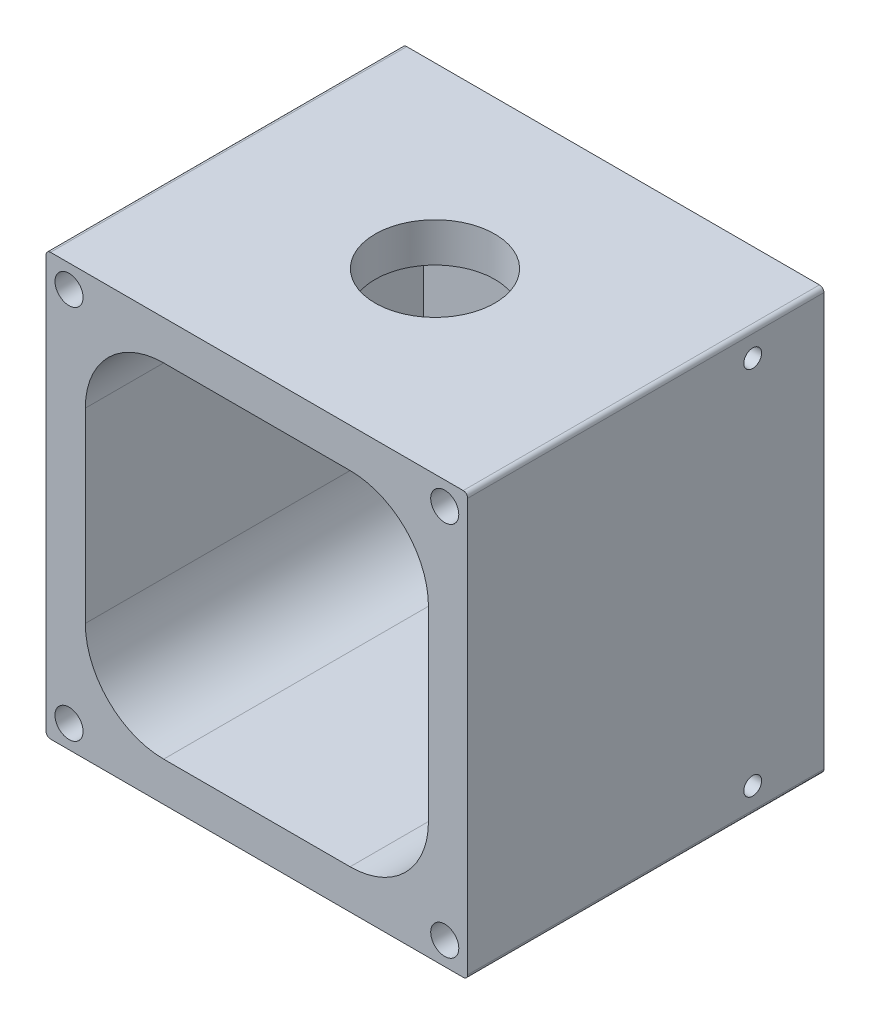
ISO-10303-21;
HEADER;
FILE_DESCRIPTION(('STEP AP214'),'2;1');
FILE_NAME('part.step','',(''),(''),'','','');
FILE_SCHEMA(('AUTOMOTIVE_DESIGN { 1 0 10303 214 1 1 1 1 }'));
ENDSEC;
DATA;
#1=APPLICATION_CONTEXT('core data for automotive mechanical design processes');
#2=APPLICATION_PROTOCOL_DEFINITION('international standard','automotive_design',2000,#1);
#3=PRODUCT_CONTEXT('',#1,'mechanical');
#4=PRODUCT('Part','Part','',(#3));
#5=PRODUCT_RELATED_PRODUCT_CATEGORY('part','',(#4));
#6=PRODUCT_DEFINITION_FORMATION('','',#4);
#7=PRODUCT_DEFINITION_CONTEXT('part definition',#1,'design');
#8=PRODUCT_DEFINITION('design','',#6,#7);
#9=PRODUCT_DEFINITION_SHAPE('','',#8);
#10=(LENGTH_UNIT() NAMED_UNIT(*) SI_UNIT(.MILLI.,.METRE.));
#11=(NAMED_UNIT(*) PLANE_ANGLE_UNIT() SI_UNIT($,.RADIAN.));
#12=(NAMED_UNIT(*) SI_UNIT($,.STERADIAN.) SOLID_ANGLE_UNIT());
#13=UNCERTAINTY_MEASURE_WITH_UNIT(LENGTH_MEASURE(1.E-05),#10,'distance_accuracy_value','');
#14=(GEOMETRIC_REPRESENTATION_CONTEXT(3) GLOBAL_UNCERTAINTY_ASSIGNED_CONTEXT((#13)) GLOBAL_UNIT_ASSIGNED_CONTEXT((#10,
#11,#12)) REPRESENTATION_CONTEXT('',''));
#15=CARTESIAN_POINT('',(0.,0.,0.));
#16=DIRECTION('',(0.,0.,1.));
#17=DIRECTION('',(1.,0.,0.));
#18=AXIS2_PLACEMENT_3D('',#15,#16,#17);
#19=CARTESIAN_POINT('',(0.,-30.5825455152328,-63.5));
#20=DIRECTION('',(0.,-1.,0.));
#21=DIRECTION('',(0.,0.,-1.));
#22=AXIS2_PLACEMENT_3D('',#19,#20,#21);
#23=PLANE('',#22);
#24=DIRECTION('',(0.,0.,1.));
#25=VECTOR('',#24,1.);
#26=CARTESIAN_POINT('',(16.6157149595406,-30.5825455152328,-63.5));
#27=LINE('',#26,#25);
#28=CARTESIAN_POINT('',(16.6157149595406,-30.5825455152328,-60.325));
#29=VERTEX_POINT('',#28);
#30=CARTESIAN_POINT('',(16.6157149595406,-30.5825455152328,0.));
#31=VERTEX_POINT('',#30);
#32=EDGE_CURVE('E50',#29,#31,#27,.T.);
#33=ORIENTED_EDGE('',*,*,#32,.F.);
#34=DIRECTION('',(-1.,0.,0.));
#35=VECTOR('',#34,1.);
#36=CARTESIAN_POINT('',(0.,-30.5825455152328,-60.325));
#37=LINE('',#36,#35);
#38=CARTESIAN_POINT('',(-16.6157149595406,-30.5825455152328,-60.325));
#39=VERTEX_POINT('',#38);
#40=EDGE_CURVE('E169',#29,#39,#37,.T.);
#41=ORIENTED_EDGE('',*,*,#40,.T.);
#42=DIRECTION('',(0.,0.,1.));
#43=VECTOR('',#42,1.);
#44=CARTESIAN_POINT('',(-16.6157149595406,-30.5825455152328,-63.5));
#45=LINE('',#44,#43);
#46=CARTESIAN_POINT('',(-16.6157149595406,-30.5825455152328,0.));
#47=VERTEX_POINT('',#46);
#48=EDGE_CURVE('E155',#39,#47,#45,.T.);
#49=ORIENTED_EDGE('',*,*,#48,.T.);
#50=DIRECTION('',(1.,0.,0.));
#51=VECTOR('',#50,1.);
#52=CARTESIAN_POINT('',(0.,-30.5825455152328,0.));
#53=LINE('',#52,#51);
#54=EDGE_CURVE('E297',#47,#31,#53,.T.);
#55=ORIENTED_EDGE('',*,*,#54,.T.);
#56=EDGE_LOOP('',(#33,#41,#49,#55));
#57=FACE_BOUND('',#56,.T.);
#58=ADVANCED_FACE('F41',(#57),#23,.F.);
#59=CARTESIAN_POINT('',(16.6157149595406,-16.6157149595406,-63.5));
#60=DIRECTION('',(0.,0.,1.));
#61=DIRECTION('',(1.,0.,0.));
#62=AXIS2_PLACEMENT_3D('',#59,#60,#61);
#63=CYLINDRICAL_SURFACE('',#62,13.9668305556922);
#64=CARTESIAN_POINT('',(16.6157149595406,-16.6157149595406,-60.325));
#65=DIRECTION('',(0.,0.,1.));
#66=DIRECTION('',(1.,0.,0.));
#67=AXIS2_PLACEMENT_3D('',#64,#65,#66);
#68=CIRCLE('',#67,13.9668305556922);
#69=CARTESIAN_POINT('',(30.5825455152328,-16.6157149595406,-60.325));
#70=VERTEX_POINT('',#69);
#71=EDGE_CURVE('E57',#29,#70,#68,.T.);
#72=ORIENTED_EDGE('',*,*,#71,.F.);
#73=ORIENTED_EDGE('',*,*,#32,.T.);
#74=CARTESIAN_POINT('',(16.6157149595406,-16.6157149595406,0.));
#75=DIRECTION('',(0.,0.,1.));
#76=DIRECTION('',(1.,0.,0.));
#77=AXIS2_PLACEMENT_3D('',#74,#75,#76);
#78=CIRCLE('',#77,13.9668305556922);
#79=CARTESIAN_POINT('',(30.5825455152328,-16.6157149595406,0.));
#80=VERTEX_POINT('',#79);
#81=EDGE_CURVE('E242',#80,#31,#78,.F.);
#82=ORIENTED_EDGE('',*,*,#81,.F.);
#83=DIRECTION('',(0.,0.,1.));
#84=VECTOR('',#83,1.);
#85=CARTESIAN_POINT('',(30.5825455152328,-16.6157149595406,-63.5));
#86=LINE('',#85,#84);
#87=EDGE_CURVE('E327',#70,#80,#86,.T.);
#88=ORIENTED_EDGE('',*,*,#87,.F.);
#89=EDGE_LOOP('',(#72,#73,#82,#88));
#90=FACE_BOUND('',#89,.T.);
#91=ADVANCED_FACE('F416',(#90),#63,.F.);
#92=CARTESIAN_POINT('',(30.5825455152328,0.,-63.5));
#93=DIRECTION('',(1.,0.,0.));
#94=DIRECTION('',(0.,0.,-1.));
#95=AXIS2_PLACEMENT_3D('',#92,#93,#94);
#96=PLANE('',#95);
#97=DIRECTION('',(0.,0.,1.));
#98=VECTOR('',#97,1.);
#99=CARTESIAN_POINT('',(30.5825455152328,16.6157149595406,-63.5));
#100=LINE('',#99,#98);
#101=CARTESIAN_POINT('',(30.5825455152328,16.6157149595406,-60.325));
#102=VERTEX_POINT('',#101);
#103=CARTESIAN_POINT('',(30.5825455152328,16.6157149595406,0.));
#104=VERTEX_POINT('',#103);
#105=EDGE_CURVE('E330',#102,#104,#100,.T.);
#106=ORIENTED_EDGE('',*,*,#105,.F.);
#107=DIRECTION('',(0.,-1.,0.));
#108=VECTOR('',#107,1.);
#109=CARTESIAN_POINT('',(30.5825455152328,0.,-60.325));
#110=LINE('',#109,#108);
#111=EDGE_CURVE('E65',#102,#70,#110,.T.);
#112=ORIENTED_EDGE('',*,*,#111,.T.);
#113=ORIENTED_EDGE('',*,*,#87,.T.);
#114=DIRECTION('',(0.,1.,0.));
#115=VECTOR('',#114,1.);
#116=CARTESIAN_POINT('',(30.5825455152328,0.,0.));
#117=LINE('',#116,#115);
#118=EDGE_CURVE('E318',#80,#104,#117,.T.);
#119=ORIENTED_EDGE('',*,*,#118,.T.);
#120=EDGE_LOOP('',(#106,#112,#113,#119));
#121=FACE_BOUND('',#120,.T.);
#122=ADVANCED_FACE('F421',(#121),#96,.F.);
#123=CARTESIAN_POINT('',(16.6157149595406,16.6157149595406,-63.5));
#124=DIRECTION('',(0.,0.,1.));
#125=DIRECTION('',(1.,0.,0.));
#126=AXIS2_PLACEMENT_3D('',#123,#124,#125);
#127=CYLINDRICAL_SURFACE('',#126,13.9668305556922);
#128=CARTESIAN_POINT('',(16.6157149595406,16.6157149595406,-60.325));
#129=DIRECTION('',(0.,0.,1.));
#130=DIRECTION('',(1.,0.,0.));
#131=AXIS2_PLACEMENT_3D('',#128,#129,#130);
#132=CIRCLE('',#131,13.9668305556922);
#133=CARTESIAN_POINT('',(16.6157149595406,30.5825455152328,-60.325));
#134=VERTEX_POINT('',#133);
#135=EDGE_CURVE('E197',#102,#134,#132,.T.);
#136=ORIENTED_EDGE('',*,*,#135,.F.);
#137=ORIENTED_EDGE('',*,*,#105,.T.);
#138=CARTESIAN_POINT('',(16.6157149595406,16.6157149595406,0.));
#139=DIRECTION('',(0.,0.,1.));
#140=DIRECTION('',(1.,0.,0.));
#141=AXIS2_PLACEMENT_3D('',#138,#139,#140);
#142=CIRCLE('',#141,13.9668305556922);
#143=CARTESIAN_POINT('',(16.6157149595406,30.5825455152328,0.));
#144=VERTEX_POINT('',#143);
#145=EDGE_CURVE('E314',#144,#104,#142,.F.);
#146=ORIENTED_EDGE('',*,*,#145,.F.);
#147=DIRECTION('',(0.,0.,1.));
#148=VECTOR('',#147,1.);
#149=CARTESIAN_POINT('',(16.6157149595406,30.5825455152328,-63.5));
#150=LINE('',#149,#148);
#151=EDGE_CURVE('E333',#134,#144,#150,.T.);
#152=ORIENTED_EDGE('',*,*,#151,.F.);
#153=EDGE_LOOP('',(#136,#137,#146,#152));
#154=FACE_BOUND('',#153,.T.);
#155=ADVANCED_FACE('F436',(#154),#127,.F.);
#156=CARTESIAN_POINT('',(0.,30.5825455152328,-63.5));
#157=DIRECTION('',(0.,-1.,0.));
#158=DIRECTION('',(0.,0.,-1.));
#159=AXIS2_PLACEMENT_3D('',#156,#157,#158);
#160=PLANE('',#159);
#161=CARTESIAN_POINT('',(0.,30.5825455152328,-31.75));
#162=DIRECTION('',(0.,-1.,0.));
#163=DIRECTION('',(0.,0.,-1.));
#164=AXIS2_PLACEMENT_3D('',#161,#162,#163);
#165=CIRCLE('',#164,10.668);
#166=CARTESIAN_POINT('',(0.,30.5825455152328,-42.418));
#167=VERTEX_POINT('',#166);
#168=EDGE_CURVE('E510',#167,#167,#165,.T.);
#169=ORIENTED_EDGE('',*,*,#168,.F.);
#170=EDGE_LOOP('',(#169));
#171=FACE_BOUND('',#170,.T.);
#172=DIRECTION('',(-1.,0.,0.));
#173=VECTOR('',#172,1.);
#174=CARTESIAN_POINT('',(0.,30.5825455152328,-60.325));
#175=LINE('',#174,#173);
#176=CARTESIAN_POINT('',(-16.6157149595406,30.5825455152328,-60.325));
#177=VERTEX_POINT('',#176);
#178=EDGE_CURVE('E188',#134,#177,#175,.T.);
#179=ORIENTED_EDGE('',*,*,#178,.F.);
#180=ORIENTED_EDGE('',*,*,#151,.T.);
#181=DIRECTION('',(1.,0.,0.));
#182=VECTOR('',#181,1.);
#183=CARTESIAN_POINT('',(0.,30.5825455152328,0.));
#184=LINE('',#183,#182);
#185=CARTESIAN_POINT('',(-16.6157149595406,30.5825455152328,0.));
#186=VERTEX_POINT('',#185);
#187=EDGE_CURVE('E310',#186,#144,#184,.T.);
#188=ORIENTED_EDGE('',*,*,#187,.F.);
#189=DIRECTION('',(0.,0.,1.));
#190=VECTOR('',#189,1.);
#191=CARTESIAN_POINT('',(-16.6157149595406,30.5825455152328,-63.5));
#192=LINE('',#191,#190);
#193=EDGE_CURVE('E336',#177,#186,#192,.T.);
#194=ORIENTED_EDGE('',*,*,#193,.F.);
#195=EDGE_LOOP('',(#179,#180,#188,#194));
#196=FACE_BOUND('',#195,.T.);
#197=ADVANCED_FACE('F432',(#171,#196),#160,.T.);
#198=CARTESIAN_POINT('',(-16.6157149595406,16.6157149595406,-63.5));
#199=DIRECTION('',(0.,0.,1.));
#200=DIRECTION('',(1.,0.,0.));
#201=AXIS2_PLACEMENT_3D('',#198,#199,#200);
#202=CYLINDRICAL_SURFACE('',#201,13.9668305556922);
#203=CARTESIAN_POINT('',(-16.6157149595406,16.6157149595406,-60.325));
#204=DIRECTION('',(0.,0.,1.));
#205=DIRECTION('',(1.,0.,0.));
#206=AXIS2_PLACEMENT_3D('',#203,#204,#205);
#207=CIRCLE('',#206,13.9668305556922);
#208=CARTESIAN_POINT('',(-30.5825455152328,16.6157149595406,-60.325));
#209=VERTEX_POINT('',#208);
#210=EDGE_CURVE('E180',#177,#209,#207,.T.);
#211=ORIENTED_EDGE('',*,*,#210,.F.);
#212=ORIENTED_EDGE('',*,*,#193,.T.);
#213=CARTESIAN_POINT('',(-16.6157149595406,16.6157149595406,0.));
#214=DIRECTION('',(0.,0.,1.));
#215=DIRECTION('',(1.,0.,0.));
#216=AXIS2_PLACEMENT_3D('',#213,#214,#215);
#217=CIRCLE('',#216,13.9668305556922);
#218=CARTESIAN_POINT('',(-30.5825455152328,16.6157149595406,0.));
#219=VERTEX_POINT('',#218);
#220=EDGE_CURVE('E306',#219,#186,#217,.F.);
#221=ORIENTED_EDGE('',*,*,#220,.F.);
#222=DIRECTION('',(0.,0.,1.));
#223=VECTOR('',#222,1.);
#224=CARTESIAN_POINT('',(-30.5825455152328,16.6157149595406,-63.5));
#225=LINE('',#224,#223);
#226=EDGE_CURVE('E339',#209,#219,#225,.T.);
#227=ORIENTED_EDGE('',*,*,#226,.F.);
#228=EDGE_LOOP('',(#211,#212,#221,#227));
#229=FACE_BOUND('',#228,.T.);
#230=ADVANCED_FACE('F429',(#229),#202,.F.);
#231=CARTESIAN_POINT('',(-30.5825455152328,0.,-63.5));
#232=DIRECTION('',(1.,0.,0.));
#233=DIRECTION('',(0.,0.,-1.));
#234=AXIS2_PLACEMENT_3D('',#231,#232,#233);
#235=PLANE('',#234);
#236=DIRECTION('',(0.,-1.,0.));
#237=VECTOR('',#236,1.);
#238=CARTESIAN_POINT('',(-30.5825455152328,0.,-60.325));
#239=LINE('',#238,#237);
#240=CARTESIAN_POINT('',(-30.5825455152328,-16.6157149595406,-60.325));
#241=VERTEX_POINT('',#240);
#242=EDGE_CURVE('E178',#209,#241,#239,.T.);
#243=ORIENTED_EDGE('',*,*,#242,.F.);
#244=ORIENTED_EDGE('',*,*,#226,.T.);
#245=DIRECTION('',(0.,1.,0.));
#246=VECTOR('',#245,1.);
#247=CARTESIAN_POINT('',(-30.5825455152328,0.,0.));
#248=LINE('',#247,#246);
#249=CARTESIAN_POINT('',(-30.5825455152328,-16.6157149595406,0.));
#250=VERTEX_POINT('',#249);
#251=EDGE_CURVE('E302',#250,#219,#248,.T.);
#252=ORIENTED_EDGE('',*,*,#251,.F.);
#253=DIRECTION('',(0.,0.,1.));
#254=VECTOR('',#253,1.);
#255=CARTESIAN_POINT('',(-30.5825455152328,-16.6157149595406,-63.5));
#256=LINE('',#255,#254);
#257=EDGE_CURVE('E165',#241,#250,#256,.T.);
#258=ORIENTED_EDGE('',*,*,#257,.F.);
#259=EDGE_LOOP('',(#243,#244,#252,#258));
#260=FACE_BOUND('',#259,.T.);
#261=ADVANCED_FACE('F426',(#260),#235,.T.);
#262=CARTESIAN_POINT('',(-36.7839839528867,36.7839839528867,-63.5));
#263=DIRECTION('',(0.,0.,1.));
#264=DIRECTION('',(1.,0.,0.));
#265=AXIS2_PLACEMENT_3D('',#262,#263,#264);
#266=CYLINDRICAL_SURFACE('',#265,0.793750000000006);
#267=CARTESIAN_POINT('',(-36.7839839528867,36.7839839528867,0.));
#268=DIRECTION('',(0.,0.,1.));
#269=DIRECTION('',(1.,0.,0.));
#270=AXIS2_PLACEMENT_3D('',#267,#268,#269);
#271=CIRCLE('',#270,0.793750000000006);
#272=CARTESIAN_POINT('',(-37.5777339528867,36.7839839528867,0.));
#273=VERTEX_POINT('',#272);
#274=CARTESIAN_POINT('',(-36.7839839528867,37.5777339528867,0.));
#275=VERTEX_POINT('',#274);
#276=EDGE_CURVE('E233',#273,#275,#271,.F.);
#277=ORIENTED_EDGE('',*,*,#276,.T.);
#278=DIRECTION('',(0.,0.,1.));
#279=VECTOR('',#278,1.);
#280=CARTESIAN_POINT('',(-36.7839839528867,37.5777339528867,-63.5));
#281=LINE('',#280,#279);
#282=CARTESIAN_POINT('',(-36.7839839528867,37.5777339528867,-63.5));
#283=VERTEX_POINT('',#282);
#284=EDGE_CURVE('E166',#283,#275,#281,.T.);
#285=ORIENTED_EDGE('',*,*,#284,.F.);
#286=CARTESIAN_POINT('',(-36.7839839528867,36.7839839528867,-63.5));
#287=DIRECTION('',(0.,0.,1.));
#288=DIRECTION('',(1.,0.,0.));
#289=AXIS2_PLACEMENT_3D('',#286,#287,#288);
#290=CIRCLE('',#289,0.793750000000006);
#291=CARTESIAN_POINT('',(-37.5777339528867,36.7839839528867,-63.5));
#292=VERTEX_POINT('',#291);
#293=EDGE_CURVE('E237',#292,#283,#290,.F.);
#294=ORIENTED_EDGE('',*,*,#293,.F.);
#295=DIRECTION('',(0.,0.,1.));
#296=VECTOR('',#295,1.);
#297=CARTESIAN_POINT('',(-37.5777339528867,36.7839839528867,-63.5));
#298=LINE('',#297,#296);
#299=EDGE_CURVE('E265',#292,#273,#298,.T.);
#300=ORIENTED_EDGE('',*,*,#299,.T.);
#301=EDGE_LOOP('',(#277,#285,#294,#300));
#302=FACE_BOUND('',#301,.T.);
#303=ADVANCED_FACE('F43',(#302),#266,.T.);
#304=CARTESIAN_POINT('',(0.,37.5777339528867,-63.5));
#305=DIRECTION('',(0.,-1.,0.));
#306=DIRECTION('',(0.,0.,-1.));
#307=AXIS2_PLACEMENT_3D('',#304,#305,#306);
#308=PLANE('',#307);
#309=CARTESIAN_POINT('',(0.,37.5777339528867,-31.75));
#310=DIRECTION('',(0.,1.,0.));
#311=DIRECTION('',(-1.,0.,0.));
#312=AXIS2_PLACEMENT_3D('',#309,#310,#311);
#313=CIRCLE('',#312,10.668);
#314=CARTESIAN_POINT('',(-10.668,37.5777339528867,-31.75));
#315=VERTEX_POINT('',#314);
#316=EDGE_CURVE('E513',#315,#315,#313,.F.);
#317=ORIENTED_EDGE('',*,*,#316,.T.);
#318=EDGE_LOOP('',(#317));
#319=FACE_BOUND('',#318,.T.);
#320=DIRECTION('',(1.,0.,0.));
#321=VECTOR('',#320,1.);
#322=CARTESIAN_POINT('',(0.,37.5777339528867,0.));
#323=LINE('',#322,#321);
#324=CARTESIAN_POINT('',(36.783983997871,37.5777339528867,0.));
#325=VERTEX_POINT('',#324);
#326=EDGE_CURVE('E293',#275,#325,#323,.T.);
#327=ORIENTED_EDGE('',*,*,#326,.T.);
#328=DIRECTION('',(0.,0.,1.));
#329=VECTOR('',#328,1.);
#330=CARTESIAN_POINT('',(36.783983997871,37.5777339528867,-63.5));
#331=LINE('',#330,#329);
#332=CARTESIAN_POINT('',(36.783983997871,37.5777339528867,-63.5));
#333=VERTEX_POINT('',#332);
#334=EDGE_CURVE('E346',#333,#325,#331,.T.);
#335=ORIENTED_EDGE('',*,*,#334,.F.);
#336=DIRECTION('',(1.,0.,0.));
#337=VECTOR('',#336,1.);
#338=CARTESIAN_POINT('',(0.,37.5777339528867,-63.5));
#339=LINE('',#338,#337);
#340=EDGE_CURVE('E262',#283,#333,#339,.T.);
#341=ORIENTED_EDGE('',*,*,#340,.F.);
#342=ORIENTED_EDGE('',*,*,#284,.T.);
#343=EDGE_LOOP('',(#327,#335,#341,#342));
#344=FACE_BOUND('',#343,.T.);
#345=ADVANCED_FACE('F383',(#319,#344),#308,.F.);
#346=CARTESIAN_POINT('',(36.783983997871,36.7839839528867,-63.5));
#347=DIRECTION('',(0.,0.,1.));
#348=DIRECTION('',(1.,0.,0.));
#349=AXIS2_PLACEMENT_3D('',#346,#347,#348);
#350=CYLINDRICAL_SURFACE('',#349,0.79375000000001);
#351=CARTESIAN_POINT('',(36.783983997871,36.7839839528867,0.));
#352=DIRECTION('',(0.,0.,1.));
#353=DIRECTION('',(1.,0.,0.));
#354=AXIS2_PLACEMENT_3D('',#351,#352,#353);
#355=CIRCLE('',#354,0.79375000000001);
#356=CARTESIAN_POINT('',(37.577733997871,36.7839839528867,0.));
#357=VERTEX_POINT('',#356);
#358=EDGE_CURVE('E289',#357,#325,#355,.T.);
#359=ORIENTED_EDGE('',*,*,#358,.F.);
#360=DIRECTION('',(0.,0.,1.));
#361=VECTOR('',#360,1.);
#362=CARTESIAN_POINT('',(37.577733997871,36.7839839528867,-63.5));
#363=LINE('',#362,#361);
#364=CARTESIAN_POINT('',(37.577733997871,36.7839839528867,-63.5));
#365=VERTEX_POINT('',#364);
#366=EDGE_CURVE('E349',#365,#357,#363,.T.);
#367=ORIENTED_EDGE('',*,*,#366,.F.);
#368=CARTESIAN_POINT('',(36.783983997871,36.7839839528867,-63.5));
#369=DIRECTION('',(0.,0.,1.));
#370=DIRECTION('',(1.,0.,0.));
#371=AXIS2_PLACEMENT_3D('',#368,#369,#370);
#372=CIRCLE('',#371,0.79375000000001);
#373=EDGE_CURVE('E258',#365,#333,#372,.T.);
#374=ORIENTED_EDGE('',*,*,#373,.T.);
#375=ORIENTED_EDGE('',*,*,#334,.T.);
#376=EDGE_LOOP('',(#359,#367,#374,#375));
#377=FACE_BOUND('',#376,.T.);
#378=ADVANCED_FACE('F404',(#377),#350,.T.);
#379=CARTESIAN_POINT('',(37.577733997871,0.,-63.5));
#380=DIRECTION('',(-1.,0.,0.));
#381=DIRECTION('',(0.,0.,1.));
#382=AXIS2_PLACEMENT_3D('',#379,#380,#381);
#383=PLANE('',#382);
#384=CARTESIAN_POINT('',(37.577733997871,33.0057339528867,-50.8));
#385=DIRECTION('',(1.,0.,0.));
#386=DIRECTION('',(0.,1.,0.));
#387=AXIS2_PLACEMENT_3D('',#384,#385,#386);
#388=CIRCLE('',#387,1.5875);
#389=CARTESIAN_POINT('',(37.577733997871,34.5932339528867,-50.8));
#390=VERTEX_POINT('',#389);
#391=EDGE_CURVE('E524',#390,#390,#388,.T.);
#392=ORIENTED_EDGE('',*,*,#391,.F.);
#393=EDGE_LOOP('',(#392));
#394=FACE_BOUND('',#393,.T.);
#395=CARTESIAN_POINT('',(37.577733997871,-33.005733997871,-50.8));
#396=DIRECTION('',(1.,0.,0.));
#397=DIRECTION('',(0.,1.,0.));
#398=AXIS2_PLACEMENT_3D('',#395,#396,#397);
#399=CIRCLE('',#398,1.5875);
#400=CARTESIAN_POINT('',(37.577733997871,-31.418233997871,-50.8));
#401=VERTEX_POINT('',#400);
#402=EDGE_CURVE('E517',#401,#401,#399,.T.);
#403=ORIENTED_EDGE('',*,*,#402,.F.);
#404=EDGE_LOOP('',(#403));
#405=FACE_BOUND('',#404,.T.);
#406=DIRECTION('',(0.,-1.,0.));
#407=VECTOR('',#406,1.);
#408=CARTESIAN_POINT('',(37.577733997871,0.,0.));
#409=LINE('',#408,#407);
#410=CARTESIAN_POINT('',(37.577733997871,-36.783983997871,0.));
#411=VERTEX_POINT('',#410);
#412=EDGE_CURVE('E285',#357,#411,#409,.T.);
#413=ORIENTED_EDGE('',*,*,#412,.T.);
#414=DIRECTION('',(0.,0.,1.));
#415=VECTOR('',#414,1.);
#416=CARTESIAN_POINT('',(37.577733997871,-36.783983997871,-63.5));
#417=LINE('',#416,#415);
#418=CARTESIAN_POINT('',(37.577733997871,-36.783983997871,-63.5));
#419=VERTEX_POINT('',#418);
#420=EDGE_CURVE('E352',#419,#411,#417,.T.);
#421=ORIENTED_EDGE('',*,*,#420,.F.);
#422=DIRECTION('',(0.,-1.,0.));
#423=VECTOR('',#422,1.);
#424=CARTESIAN_POINT('',(37.577733997871,0.,-63.5));
#425=LINE('',#424,#423);
#426=EDGE_CURVE('E255',#365,#419,#425,.T.);
#427=ORIENTED_EDGE('',*,*,#426,.F.);
#428=ORIENTED_EDGE('',*,*,#366,.T.);
#429=EDGE_LOOP('',(#413,#421,#427,#428));
#430=FACE_BOUND('',#429,.T.);
#431=ADVANCED_FACE('F402',(#394,#405,#430),#383,.F.);
#432=CARTESIAN_POINT('',(36.783983997871,-36.783983997871,-63.5));
#433=DIRECTION('',(0.,0.,1.));
#434=DIRECTION('',(1.,0.,0.));
#435=AXIS2_PLACEMENT_3D('',#432,#433,#434);
#436=CYLINDRICAL_SURFACE('',#435,0.793750000000003);
#437=CARTESIAN_POINT('',(36.783983997871,-36.783983997871,0.));
#438=DIRECTION('',(0.,0.,1.));
#439=DIRECTION('',(1.,0.,0.));
#440=AXIS2_PLACEMENT_3D('',#437,#438,#439);
#441=CIRCLE('',#440,0.793750000000003);
#442=CARTESIAN_POINT('',(36.783983997871,-37.577733997871,0.));
#443=VERTEX_POINT('',#442);
#444=EDGE_CURVE('E281',#443,#411,#441,.T.);
#445=ORIENTED_EDGE('',*,*,#444,.F.);
#446=DIRECTION('',(0.,0.,1.));
#447=VECTOR('',#446,1.);
#448=CARTESIAN_POINT('',(36.783983997871,-37.577733997871,-63.5));
#449=LINE('',#448,#447);
#450=CARTESIAN_POINT('',(36.783983997871,-37.577733997871,-63.5));
#451=VERTEX_POINT('',#450);
#452=EDGE_CURVE('E355',#451,#443,#449,.T.);
#453=ORIENTED_EDGE('',*,*,#452,.F.);
#454=CARTESIAN_POINT('',(36.783983997871,-36.783983997871,-63.5));
#455=DIRECTION('',(0.,0.,1.));
#456=DIRECTION('',(1.,0.,0.));
#457=AXIS2_PLACEMENT_3D('',#454,#455,#456);
#458=CIRCLE('',#457,0.793750000000003);
#459=EDGE_CURVE('E251',#451,#419,#458,.T.);
#460=ORIENTED_EDGE('',*,*,#459,.T.);
#461=ORIENTED_EDGE('',*,*,#420,.T.);
#462=EDGE_LOOP('',(#445,#453,#460,#461));
#463=FACE_BOUND('',#462,.T.);
#464=ADVANCED_FACE('F398',(#463),#436,.T.);
#465=CARTESIAN_POINT('',(0.,-37.577733997871,-63.5));
#466=DIRECTION('',(0.,1.,0.));
#467=DIRECTION('',(-1.,0.,0.));
#468=AXIS2_PLACEMENT_3D('',#465,#466,#467);
#469=PLANE('',#468);
#470=DIRECTION('',(-1.,0.,0.));
#471=VECTOR('',#470,1.);
#472=CARTESIAN_POINT('',(0.,-37.577733997871,0.));
#473=LINE('',#472,#471);
#474=CARTESIAN_POINT('',(-36.7839839528867,-37.577733997871,0.));
#475=VERTEX_POINT('',#474);
#476=EDGE_CURVE('E277',#443,#475,#473,.T.);
#477=ORIENTED_EDGE('',*,*,#476,.T.);
#478=DIRECTION('',(0.,0.,1.));
#479=VECTOR('',#478,1.);
#480=CARTESIAN_POINT('',(-36.7839839528867,-37.577733997871,-63.5));
#481=LINE('',#480,#479);
#482=CARTESIAN_POINT('',(-36.7839839528867,-37.577733997871,-63.5));
#483=VERTEX_POINT('',#482);
#484=EDGE_CURVE('E358',#483,#475,#481,.T.);
#485=ORIENTED_EDGE('',*,*,#484,.F.);
#486=DIRECTION('',(-1.,0.,0.));
#487=VECTOR('',#486,1.);
#488=CARTESIAN_POINT('',(0.,-37.577733997871,-63.5));
#489=LINE('',#488,#487);
#490=EDGE_CURVE('E248',#451,#483,#489,.T.);
#491=ORIENTED_EDGE('',*,*,#490,.F.);
#492=ORIENTED_EDGE('',*,*,#452,.T.);
#493=EDGE_LOOP('',(#477,#485,#491,#492));
#494=FACE_BOUND('',#493,.T.);
#495=ADVANCED_FACE('F636',(#494),#469,.F.);
#496=CARTESIAN_POINT('',(-36.7839839528867,-36.783983997871,-63.5));
#497=DIRECTION('',(0.,0.,1.));
#498=DIRECTION('',(1.,0.,0.));
#499=AXIS2_PLACEMENT_3D('',#496,#497,#498);
#500=CYLINDRICAL_SURFACE('',#499,0.793749999999999);
#501=CARTESIAN_POINT('',(-36.7839839528867,-36.783983997871,0.));
#502=DIRECTION('',(0.,0.,1.));
#503=DIRECTION('',(1.,0.,0.));
#504=AXIS2_PLACEMENT_3D('',#501,#502,#503);
#505=CIRCLE('',#504,0.793749999999999);
#506=CARTESIAN_POINT('',(-37.5777339528867,-36.783983997871,0.));
#507=VERTEX_POINT('',#506);
#508=EDGE_CURVE('E273',#475,#507,#505,.F.);
#509=ORIENTED_EDGE('',*,*,#508,.T.);
#510=DIRECTION('',(0.,0.,1.));
#511=VECTOR('',#510,1.);
#512=CARTESIAN_POINT('',(-37.5777339528867,-36.783983997871,-63.5));
#513=LINE('',#512,#511);
#514=CARTESIAN_POINT('',(-37.5777339528867,-36.783983997871,-63.5));
#515=VERTEX_POINT('',#514);
#516=EDGE_CURVE('E361',#515,#507,#513,.T.);
#517=ORIENTED_EDGE('',*,*,#516,.F.);
#518=CARTESIAN_POINT('',(-36.7839839528867,-36.783983997871,-63.5));
#519=DIRECTION('',(0.,0.,1.));
#520=DIRECTION('',(1.,0.,0.));
#521=AXIS2_PLACEMENT_3D('',#518,#519,#520);
#522=CIRCLE('',#521,0.793749999999999);
#523=EDGE_CURVE('E245',#483,#515,#522,.F.);
#524=ORIENTED_EDGE('',*,*,#523,.F.);
#525=ORIENTED_EDGE('',*,*,#484,.T.);
#526=EDGE_LOOP('',(#509,#517,#524,#525));
#527=FACE_BOUND('',#526,.T.);
#528=ADVANCED_FACE('F393',(#527),#500,.T.);
#529=CARTESIAN_POINT('',(-37.5777339528867,0.,-63.5));
#530=DIRECTION('',(1.,0.,0.));
#531=DIRECTION('',(0.,1.,0.));
#532=AXIS2_PLACEMENT_3D('',#529,#530,#531);
#533=PLANE('',#532);
#534=DIRECTION('',(0.,1.,0.));
#535=VECTOR('',#534,1.);
#536=CARTESIAN_POINT('',(-37.5777339528867,0.,0.));
#537=LINE('',#536,#535);
#538=EDGE_CURVE('E269',#507,#273,#537,.T.);
#539=ORIENTED_EDGE('',*,*,#538,.T.);
#540=ORIENTED_EDGE('',*,*,#299,.F.);
#541=DIRECTION('',(0.,1.,0.));
#542=VECTOR('',#541,1.);
#543=CARTESIAN_POINT('',(-37.5777339528867,0.,-63.5));
#544=LINE('',#543,#542);
#545=EDGE_CURVE('E241',#515,#292,#544,.T.);
#546=ORIENTED_EDGE('',*,*,#545,.F.);
#547=ORIENTED_EDGE('',*,*,#516,.T.);
#548=EDGE_LOOP('',(#539,#540,#546,#547));
#549=FACE_BOUND('',#548,.T.);
#550=ADVANCED_FACE('F372',(#549),#533,.F.);
#551=CARTESIAN_POINT('',(-16.6157149595406,-16.6157149595406,-63.5));
#552=DIRECTION('',(0.,0.,1.));
#553=DIRECTION('',(1.,0.,0.));
#554=AXIS2_PLACEMENT_3D('',#551,#552,#553);
#555=CYLINDRICAL_SURFACE('',#554,13.9668305556922);
#556=CARTESIAN_POINT('',(-16.6157149595406,-16.6157149595406,-60.325));
#557=DIRECTION('',(0.,0.,1.));
#558=DIRECTION('',(1.,0.,0.));
#559=AXIS2_PLACEMENT_3D('',#556,#557,#558);
#560=CIRCLE('',#559,13.9668305556922);
#561=EDGE_CURVE('E11',#241,#39,#560,.T.);
#562=ORIENTED_EDGE('',*,*,#561,.F.);
#563=ORIENTED_EDGE('',*,*,#257,.T.);
#564=CARTESIAN_POINT('',(-16.6157149595406,-16.6157149595406,0.));
#565=DIRECTION('',(0.,0.,1.));
#566=DIRECTION('',(1.,0.,0.));
#567=AXIS2_PLACEMENT_3D('',#564,#565,#566);
#568=CIRCLE('',#567,13.9668305556922);
#569=EDGE_CURVE('E160',#47,#250,#568,.F.);
#570=ORIENTED_EDGE('',*,*,#569,.F.);
#571=ORIENTED_EDGE('',*,*,#48,.F.);
#572=EDGE_LOOP('',(#562,#563,#570,#571));
#573=FACE_BOUND('',#572,.T.);
#574=ADVANCED_FACE('F157',(#573),#555,.F.);
#575=CARTESIAN_POINT('',(0.,0.,-63.5));
#576=DIRECTION('',(0.,0.,1.));
#577=DIRECTION('',(1.,0.,0.));
#578=AXIS2_PLACEMENT_3D('',#575,#576,#577);
#579=PLANE('',#578);
#580=ORIENTED_EDGE('',*,*,#293,.T.);
#581=ORIENTED_EDGE('',*,*,#340,.T.);
#582=ORIENTED_EDGE('',*,*,#373,.F.);
#583=ORIENTED_EDGE('',*,*,#426,.T.);
#584=ORIENTED_EDGE('',*,*,#459,.F.);
#585=ORIENTED_EDGE('',*,*,#490,.T.);
#586=ORIENTED_EDGE('',*,*,#523,.T.);
#587=ORIENTED_EDGE('',*,*,#545,.T.);
#588=EDGE_LOOP('',(#580,#581,#582,#583,#584,#585,#586,#587));
#589=FACE_BOUND('',#588,.T.);
#590=CARTESIAN_POINT('',(0.,0.,-63.5));
#591=DIRECTION('',(0.,0.,1.));
#592=DIRECTION('',(1.,0.,0.));
#593=AXIS2_PLACEMENT_3D('',#590,#591,#592);
#594=CIRCLE('',#593,12.5);
#595=CARTESIAN_POINT('',(12.5,0.,-63.5));
#596=VERTEX_POINT('',#595);
#597=EDGE_CURVE('E191',#596,#596,#594,.T.);
#598=ORIENTED_EDGE('',*,*,#597,.T.);
#599=EDGE_LOOP('',(#598));
#600=FACE_BOUND('',#599,.T.);
#601=ADVANCED_FACE('F386',(#589,#600),#579,.F.);
#602=CARTESIAN_POINT('',(0.,0.,0.));
#603=DIRECTION('',(0.,0.,1.));
#604=DIRECTION('',(1.,0.,0.));
#605=AXIS2_PLACEMENT_3D('',#602,#603,#604);
#606=PLANE('',#605);
#607=CARTESIAN_POINT('',(-33.488333997871,33.488333997871,0.));
#608=DIRECTION('',(0.,0.,1.));
#609=DIRECTION('',(1.,0.,0.));
#610=AXIS2_PLACEMENT_3D('',#607,#608,#609);
#611=CIRCLE('',#610,2.50189999999996);
#612=CARTESIAN_POINT('',(-30.986433997871,33.488333997871,0.));
#613=VERTEX_POINT('',#612);
#614=EDGE_CURVE('E172',#613,#613,#611,.T.);
#615=ORIENTED_EDGE('',*,*,#614,.F.);
#616=EDGE_LOOP('',(#615));
#617=FACE_BOUND('',#616,.T.);
#618=CARTESIAN_POINT('',(-33.488333997871,-33.488333997871,0.));
#619=DIRECTION('',(0.,0.,1.));
#620=DIRECTION('',(1.,0.,0.));
#621=AXIS2_PLACEMENT_3D('',#618,#619,#620);
#622=CIRCLE('',#621,2.5019);
#623=CARTESIAN_POINT('',(-30.986433997871,-33.488333997871,0.));
#624=VERTEX_POINT('',#623);
#625=EDGE_CURVE('E218',#624,#624,#622,.T.);
#626=ORIENTED_EDGE('',*,*,#625,.F.);
#627=EDGE_LOOP('',(#626));
#628=FACE_BOUND('',#627,.T.);
#629=CARTESIAN_POINT('',(33.488333997871,-33.488333997871,0.));
#630=DIRECTION('',(0.,0.,1.));
#631=DIRECTION('',(1.,0.,0.));
#632=AXIS2_PLACEMENT_3D('',#629,#630,#631);
#633=CIRCLE('',#632,2.5019);
#634=CARTESIAN_POINT('',(35.990233997871,-33.488333997871,0.));
#635=VERTEX_POINT('',#634);
#636=EDGE_CURVE('E210',#635,#635,#633,.T.);
#637=ORIENTED_EDGE('',*,*,#636,.F.);
#638=EDGE_LOOP('',(#637));
#639=FACE_BOUND('',#638,.T.);
#640=CARTESIAN_POINT('',(33.488333997871,33.488333997871,0.));
#641=DIRECTION('',(0.,0.,1.));
#642=DIRECTION('',(1.,0.,0.));
#643=AXIS2_PLACEMENT_3D('',#640,#641,#642);
#644=CIRCLE('',#643,2.5019);
#645=CARTESIAN_POINT('',(35.990233997871,33.488333997871,0.));
#646=VERTEX_POINT('',#645);
#647=EDGE_CURVE('E209',#646,#646,#644,.T.);
#648=ORIENTED_EDGE('',*,*,#647,.F.);
#649=EDGE_LOOP('',(#648));
#650=FACE_BOUND('',#649,.T.);
#651=ORIENTED_EDGE('',*,*,#276,.F.);
#652=ORIENTED_EDGE('',*,*,#538,.F.);
#653=ORIENTED_EDGE('',*,*,#508,.F.);
#654=ORIENTED_EDGE('',*,*,#476,.F.);
#655=ORIENTED_EDGE('',*,*,#444,.T.);
#656=ORIENTED_EDGE('',*,*,#412,.F.);
#657=ORIENTED_EDGE('',*,*,#358,.T.);
#658=ORIENTED_EDGE('',*,*,#326,.F.);
#659=EDGE_LOOP('',(#651,#652,#653,#654,#655,#656,#657,#658));
#660=FACE_BOUND('',#659,.T.);
#661=ORIENTED_EDGE('',*,*,#54,.F.);
#662=ORIENTED_EDGE('',*,*,#569,.T.);
#663=ORIENTED_EDGE('',*,*,#251,.T.);
#664=ORIENTED_EDGE('',*,*,#220,.T.);
#665=ORIENTED_EDGE('',*,*,#187,.T.);
#666=ORIENTED_EDGE('',*,*,#145,.T.);
#667=ORIENTED_EDGE('',*,*,#118,.F.);
#668=ORIENTED_EDGE('',*,*,#81,.T.);
#669=EDGE_LOOP('',(#661,#662,#663,#664,#665,#666,#667,#668));
#670=FACE_BOUND('',#669,.T.);
#671=ADVANCED_FACE('F377',(#617,#628,#639,#650,#660,#670),#606,.T.);
#672=CARTESIAN_POINT('',(33.488333997871,33.488333997871,-12.7));
#673=DIRECTION('',(0.,0.,1.));
#674=DIRECTION('',(1.,0.,0.));
#675=AXIS2_PLACEMENT_3D('',#672,#673,#674);
#676=CYLINDRICAL_SURFACE('',#675,2.5019);
#677=CARTESIAN_POINT('',(33.488333997871,33.488333997871,-12.7));
#678=DIRECTION('',(0.,0.,1.));
#679=DIRECTION('',(1.,0.,0.));
#680=AXIS2_PLACEMENT_3D('',#677,#678,#679);
#681=CIRCLE('',#680,2.5019);
#682=CARTESIAN_POINT('',(35.990233997871,33.488333997871,-12.7));
#683=VERTEX_POINT('',#682);
#684=EDGE_CURVE('E229',#683,#683,#681,.T.);
#685=ORIENTED_EDGE('',*,*,#684,.F.);
#686=EDGE_LOOP('',(#685));
#687=FACE_BOUND('',#686,.T.);
#688=ORIENTED_EDGE('',*,*,#647,.T.);
#689=EDGE_LOOP('',(#688));
#690=FACE_BOUND('',#689,.T.);
#691=ADVANCED_FACE('F445',(#687,#690),#676,.F.);
#692=CARTESIAN_POINT('',(33.488333997871,33.488333997871,-12.7));
#693=DIRECTION('',(0.,0.,1.));
#694=DIRECTION('',(1.,0.,0.));
#695=AXIS2_PLACEMENT_3D('',#692,#693,#694);
#696=PLANE('',#695);
#697=ORIENTED_EDGE('',*,*,#684,.T.);
#698=EDGE_LOOP('',(#697));
#699=FACE_BOUND('',#698,.T.);
#700=ADVANCED_FACE('F451',(#699),#696,.T.);
#701=CARTESIAN_POINT('',(33.488333997871,-33.488333997871,-12.7));
#702=DIRECTION('',(0.,0.,1.));
#703=DIRECTION('',(1.,0.,0.));
#704=AXIS2_PLACEMENT_3D('',#701,#702,#703);
#705=CYLINDRICAL_SURFACE('',#704,2.5019);
#706=CARTESIAN_POINT('',(33.488333997871,-33.488333997871,-12.7));
#707=DIRECTION('',(0.,0.,1.));
#708=DIRECTION('',(1.,0.,0.));
#709=AXIS2_PLACEMENT_3D('',#706,#707,#708);
#710=CIRCLE('',#709,2.5019);
#711=CARTESIAN_POINT('',(35.990233997871,-33.488333997871,-12.7));
#712=VERTEX_POINT('',#711);
#713=EDGE_CURVE('E205',#712,#712,#710,.T.);
#714=ORIENTED_EDGE('',*,*,#713,.F.);
#715=EDGE_LOOP('',(#714));
#716=FACE_BOUND('',#715,.T.);
#717=ORIENTED_EDGE('',*,*,#636,.T.);
#718=EDGE_LOOP('',(#717));
#719=FACE_BOUND('',#718,.T.);
#720=ADVANCED_FACE('F455',(#716,#719),#705,.F.);
#721=CARTESIAN_POINT('',(33.488333997871,-33.488333997871,-12.7));
#722=DIRECTION('',(0.,0.,1.));
#723=DIRECTION('',(1.,0.,0.));
#724=AXIS2_PLACEMENT_3D('',#721,#722,#723);
#725=PLANE('',#724);
#726=ORIENTED_EDGE('',*,*,#713,.T.);
#727=EDGE_LOOP('',(#726));
#728=FACE_BOUND('',#727,.T.);
#729=ADVANCED_FACE('F469',(#728),#725,.T.);
#730=CARTESIAN_POINT('',(-33.488333997871,-33.488333997871,-12.7));
#731=DIRECTION('',(0.,0.,1.));
#732=DIRECTION('',(1.,0.,0.));
#733=AXIS2_PLACEMENT_3D('',#730,#731,#732);
#734=CYLINDRICAL_SURFACE('',#733,2.5019);
#735=CARTESIAN_POINT('',(-33.488333997871,-33.488333997871,-12.7));
#736=DIRECTION('',(0.,0.,1.));
#737=DIRECTION('',(1.,0.,0.));
#738=AXIS2_PLACEMENT_3D('',#735,#736,#737);
#739=CIRCLE('',#738,2.5019);
#740=CARTESIAN_POINT('',(-30.986433997871,-33.488333997871,-12.7));
#741=VERTEX_POINT('',#740);
#742=EDGE_CURVE('E214',#741,#741,#739,.T.);
#743=ORIENTED_EDGE('',*,*,#742,.F.);
#744=EDGE_LOOP('',(#743));
#745=FACE_BOUND('',#744,.T.);
#746=ORIENTED_EDGE('',*,*,#625,.T.);
#747=EDGE_LOOP('',(#746));
#748=FACE_BOUND('',#747,.T.);
#749=ADVANCED_FACE('F466',(#745,#748),#734,.F.);
#750=CARTESIAN_POINT('',(-33.488333997871,-33.488333997871,-12.7));
#751=DIRECTION('',(0.,0.,1.));
#752=DIRECTION('',(1.,0.,0.));
#753=AXIS2_PLACEMENT_3D('',#750,#751,#752);
#754=PLANE('',#753);
#755=ORIENTED_EDGE('',*,*,#742,.T.);
#756=EDGE_LOOP('',(#755));
#757=FACE_BOUND('',#756,.T.);
#758=ADVANCED_FACE('F461',(#757),#754,.T.);
#759=CARTESIAN_POINT('',(-33.488333997871,33.488333997871,-12.7));
#760=DIRECTION('',(0.,0.,1.));
#761=DIRECTION('',(1.,0.,0.));
#762=AXIS2_PLACEMENT_3D('',#759,#760,#761);
#763=CYLINDRICAL_SURFACE('',#762,2.50189999999996);
#764=CARTESIAN_POINT('',(-33.488333997871,33.488333997871,-12.7));
#765=DIRECTION('',(0.,0.,1.));
#766=DIRECTION('',(1.,0.,0.));
#767=AXIS2_PLACEMENT_3D('',#764,#765,#766);
#768=CIRCLE('',#767,2.50189999999996);
#769=CARTESIAN_POINT('',(-30.986433997871,33.488333997871,-12.7));
#770=VERTEX_POINT('',#769);
#771=EDGE_CURVE('E222',#770,#770,#768,.T.);
#772=ORIENTED_EDGE('',*,*,#771,.F.);
#773=EDGE_LOOP('',(#772));
#774=FACE_BOUND('',#773,.T.);
#775=ORIENTED_EDGE('',*,*,#614,.T.);
#776=EDGE_LOOP('',(#775));
#777=FACE_BOUND('',#776,.T.);
#778=ADVANCED_FACE('F457',(#774,#777),#763,.F.);
#779=CARTESIAN_POINT('',(-33.488333997871,33.488333997871,-12.7));
#780=DIRECTION('',(0.,0.,1.));
#781=DIRECTION('',(1.,0.,0.));
#782=AXIS2_PLACEMENT_3D('',#779,#780,#781);
#783=PLANE('',#782);
#784=ORIENTED_EDGE('',*,*,#771,.T.);
#785=EDGE_LOOP('',(#784));
#786=FACE_BOUND('',#785,.T.);
#787=ADVANCED_FACE('F460',(#786),#783,.T.);
#788=CARTESIAN_POINT('',(36.783983997871,36.7839839528867,-60.325));
#789=DIRECTION('',(0.,0.,1.));
#790=DIRECTION('',(1.,0.,0.));
#791=AXIS2_PLACEMENT_3D('',#788,#789,#790);
#792=PLANE('',#791);
#793=ORIENTED_EDGE('',*,*,#40,.F.);
#794=ORIENTED_EDGE('',*,*,#71,.T.);
#795=ORIENTED_EDGE('',*,*,#111,.F.);
#796=ORIENTED_EDGE('',*,*,#135,.T.);
#797=ORIENTED_EDGE('',*,*,#178,.T.);
#798=ORIENTED_EDGE('',*,*,#210,.T.);
#799=ORIENTED_EDGE('',*,*,#242,.T.);
#800=ORIENTED_EDGE('',*,*,#561,.T.);
#801=EDGE_LOOP('',(#793,#794,#795,#796,#797,#798,#799,#800));
#802=FACE_BOUND('',#801,.T.);
#803=CARTESIAN_POINT('',(0.,0.,-60.325));
#804=DIRECTION('',(0.,0.,1.));
#805=DIRECTION('',(1.,0.,0.));
#806=AXIS2_PLACEMENT_3D('',#803,#804,#805);
#807=CIRCLE('',#806,12.5);
#808=CARTESIAN_POINT('',(12.5,0.,-60.325));
#809=VERTEX_POINT('',#808);
#810=EDGE_CURVE('E184',#809,#809,#807,.T.);
#811=ORIENTED_EDGE('',*,*,#810,.F.);
#812=EDGE_LOOP('',(#811));
#813=FACE_BOUND('',#812,.T.);
#814=ADVANCED_FACE('F175',(#802,#813),#792,.T.);
#815=CARTESIAN_POINT('',(0.,0.,-60.325));
#816=DIRECTION('',(0.,0.,-1.));
#817=DIRECTION('',(-1.,0.,0.));
#818=AXIS2_PLACEMENT_3D('',#815,#816,#817);
#819=CYLINDRICAL_SURFACE('',#818,12.5);
#820=ORIENTED_EDGE('',*,*,#810,.T.);
#821=EDGE_LOOP('',(#820));
#822=FACE_BOUND('',#821,.T.);
#823=ORIENTED_EDGE('',*,*,#597,.F.);
#824=EDGE_LOOP('',(#823));
#825=FACE_BOUND('',#824,.T.);
#826=ADVANCED_FACE('F482',(#822,#825),#819,.F.);
#827=CARTESIAN_POINT('',(31.227733997871,-33.005733997871,-50.8));
#828=DIRECTION('',(1.,0.,0.));
#829=DIRECTION('',(0.,1.,0.));
#830=AXIS2_PLACEMENT_3D('',#827,#828,#829);
#831=CYLINDRICAL_SURFACE('',#830,1.5875);
#832=CARTESIAN_POINT('',(31.227733997871,-33.005733997871,-50.8));
#833=DIRECTION('',(1.,0.,0.));
#834=DIRECTION('',(0.,1.,0.));
#835=AXIS2_PLACEMENT_3D('',#832,#833,#834);
#836=CIRCLE('',#835,1.5875);
#837=CARTESIAN_POINT('',(31.227733997871,-31.418233997871,-50.8));
#838=VERTEX_POINT('',#837);
#839=EDGE_CURVE('E528',#838,#838,#836,.T.);
#840=ORIENTED_EDGE('',*,*,#839,.F.);
#841=EDGE_LOOP('',(#840));
#842=FACE_BOUND('',#841,.T.);
#843=ORIENTED_EDGE('',*,*,#402,.T.);
#844=EDGE_LOOP('',(#843));
#845=FACE_BOUND('',#844,.T.);
#846=ADVANCED_FACE('F485',(#842,#845),#831,.F.);
#847=CARTESIAN_POINT('',(31.227733997871,-33.005733997871,-50.8));
#848=DIRECTION('',(1.,0.,0.));
#849=DIRECTION('',(0.,1.,0.));
#850=AXIS2_PLACEMENT_3D('',#847,#848,#849);
#851=PLANE('',#850);
#852=ORIENTED_EDGE('',*,*,#839,.T.);
#853=EDGE_LOOP('',(#852));
#854=FACE_BOUND('',#853,.T.);
#855=ADVANCED_FACE('F489',(#854),#851,.T.);
#856=CARTESIAN_POINT('',(31.227733997871,33.0057339528867,-50.8));
#857=DIRECTION('',(1.,0.,0.));
#858=DIRECTION('',(0.,1.,0.));
#859=AXIS2_PLACEMENT_3D('',#856,#857,#858);
#860=CYLINDRICAL_SURFACE('',#859,1.5875);
#861=CARTESIAN_POINT('',(31.227733997871,33.0057339528867,-50.8));
#862=DIRECTION('',(1.,0.,0.));
#863=DIRECTION('',(0.,1.,0.));
#864=AXIS2_PLACEMENT_3D('',#861,#862,#863);
#865=CIRCLE('',#864,1.5875);
#866=CARTESIAN_POINT('',(31.227733997871,34.5932339528867,-50.8));
#867=VERTEX_POINT('',#866);
#868=EDGE_CURVE('E520',#867,#867,#865,.T.);
#869=ORIENTED_EDGE('',*,*,#868,.F.);
#870=EDGE_LOOP('',(#869));
#871=FACE_BOUND('',#870,.T.);
#872=ORIENTED_EDGE('',*,*,#391,.T.);
#873=EDGE_LOOP('',(#872));
#874=FACE_BOUND('',#873,.T.);
#875=ADVANCED_FACE('F493',(#871,#874),#860,.F.);
#876=CARTESIAN_POINT('',(31.227733997871,33.0057339528867,-50.8));
#877=DIRECTION('',(1.,0.,0.));
#878=DIRECTION('',(0.,1.,0.));
#879=AXIS2_PLACEMENT_3D('',#876,#877,#878);
#880=PLANE('',#879);
#881=ORIENTED_EDGE('',*,*,#868,.T.);
#882=EDGE_LOOP('',(#881));
#883=FACE_BOUND('',#882,.T.);
#884=ADVANCED_FACE('F497',(#883),#880,.T.);
#885=CARTESIAN_POINT('',(0.,-37.578733997871,-31.75));
#886=DIRECTION('',(0.,1.,0.));
#887=DIRECTION('',(-1.,0.,0.));
#888=AXIS2_PLACEMENT_3D('',#885,#886,#887);
#889=CYLINDRICAL_SURFACE('',#888,10.668);
#890=ORIENTED_EDGE('',*,*,#168,.T.);
#891=EDGE_LOOP('',(#890));
#892=FACE_BOUND('',#891,.T.);
#893=ORIENTED_EDGE('',*,*,#316,.F.);
#894=EDGE_LOOP('',(#893));
#895=FACE_BOUND('',#894,.T.);
#896=ADVANCED_FACE('F501',(#892,#895),#889,.F.);
#897=CLOSED_SHELL('',(#58,#91,#122,#155,#197,#230,#261,#303,#345,#378,#431,#464,#495,#528,#550,
#574,#601,#671,#691,#700,#720,#729,#749,#758,#778,#787,#814,#826,#846,#855,#875,#884,#896));
#898=MANIFOLD_SOLID_BREP('B2',#897);
#899=ADVANCED_BREP_SHAPE_REPRESENTATION('',(#18,#898),#14);
#900=SHAPE_DEFINITION_REPRESENTATION(#9,#899);
ENDSEC;
END-ISO-10303-21;
